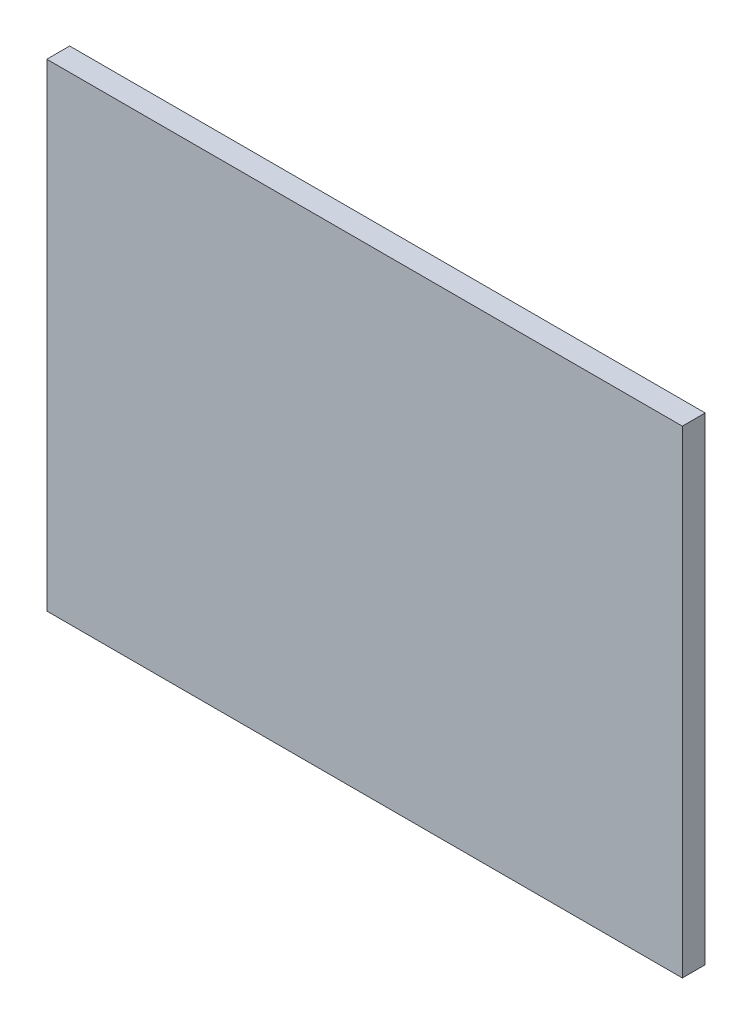
ISO-10303-21;
HEADER;
FILE_DESCRIPTION(('STEP AP214'),'2;1');
FILE_NAME('part.step','',(''),(''),'','','');
FILE_SCHEMA(('AUTOMOTIVE_DESIGN { 1 0 10303 214 1 1 1 1 }'));
ENDSEC;
DATA;
#1=APPLICATION_CONTEXT('core data for automotive mechanical design processes');
#2=APPLICATION_PROTOCOL_DEFINITION('international standard','automotive_design',2000,#1);
#3=PRODUCT_CONTEXT('',#1,'mechanical');
#4=PRODUCT('Part','Part','',(#3));
#5=PRODUCT_RELATED_PRODUCT_CATEGORY('part','',(#4));
#6=PRODUCT_DEFINITION_FORMATION('','',#4);
#7=PRODUCT_DEFINITION_CONTEXT('part definition',#1,'design');
#8=PRODUCT_DEFINITION('design','',#6,#7);
#9=PRODUCT_DEFINITION_SHAPE('','',#8);
#10=(LENGTH_UNIT() NAMED_UNIT(*) SI_UNIT(.MILLI.,.METRE.));
#11=(NAMED_UNIT(*) PLANE_ANGLE_UNIT() SI_UNIT($,.RADIAN.));
#12=(NAMED_UNIT(*) SI_UNIT($,.STERADIAN.) SOLID_ANGLE_UNIT());
#13=UNCERTAINTY_MEASURE_WITH_UNIT(LENGTH_MEASURE(1.E-05),#10,'distance_accuracy_value','');
#14=(GEOMETRIC_REPRESENTATION_CONTEXT(3) GLOBAL_UNCERTAINTY_ASSIGNED_CONTEXT((#13)) GLOBAL_UNIT_ASSIGNED_CONTEXT((#10,
#11,#12)) REPRESENTATION_CONTEXT('',''));
#15=CARTESIAN_POINT('',(0.,0.,0.));
#16=DIRECTION('',(0.,0.,1.));
#17=DIRECTION('',(1.,0.,0.));
#18=AXIS2_PLACEMENT_3D('',#15,#16,#17);
#19=CARTESIAN_POINT('',(0.,0.,18.));
#20=DIRECTION('',(1.,0.,0.));
#21=DIRECTION('',(0.,0.,-1.));
#22=AXIS2_PLACEMENT_3D('',#19,#20,#21);
#23=PLANE('',#22);
#24=DIRECTION('',(0.,-1.,0.));
#25=VECTOR('',#24,1.);
#26=CARTESIAN_POINT('',(0.,0.,0.));
#27=LINE('',#26,#25);
#28=CARTESIAN_POINT('',(0.,376.,0.));
#29=VERTEX_POINT('',#28);
#30=CARTESIAN_POINT('',(0.,0.,0.));
#31=VERTEX_POINT('',#30);
#32=EDGE_CURVE('E96',#29,#31,#27,.T.);
#33=ORIENTED_EDGE('',*,*,#32,.T.);
#34=DIRECTION('',(0.,0.,-1.));
#35=VECTOR('',#34,1.);
#36=CARTESIAN_POINT('',(0.,0.,18.));
#37=LINE('',#36,#35);
#38=CARTESIAN_POINT('',(0.,0.,18.));
#39=VERTEX_POINT('',#38);
#40=EDGE_CURVE('E11',#39,#31,#37,.T.);
#41=ORIENTED_EDGE('',*,*,#40,.F.);
#42=DIRECTION('',(0.,-1.,0.));
#43=VECTOR('',#42,1.);
#44=CARTESIAN_POINT('',(0.,0.,18.));
#45=LINE('',#44,#43);
#46=CARTESIAN_POINT('',(0.,376.,18.));
#47=VERTEX_POINT('',#46);
#48=EDGE_CURVE('E84',#47,#39,#45,.T.);
#49=ORIENTED_EDGE('',*,*,#48,.F.);
#50=DIRECTION('',(0.,0.,-1.));
#51=VECTOR('',#50,1.);
#52=CARTESIAN_POINT('',(0.,376.,18.));
#53=LINE('',#52,#51);
#54=EDGE_CURVE('E92',#47,#29,#53,.T.);
#55=ORIENTED_EDGE('',*,*,#54,.T.);
#56=EDGE_LOOP('',(#33,#41,#49,#55));
#57=FACE_BOUND('',#56,.T.);
#58=ADVANCED_FACE('F33',(#57),#23,.F.);
#59=CARTESIAN_POINT('',(0.,0.,18.));
#60=DIRECTION('',(0.,1.,0.));
#61=DIRECTION('',(0.,0.,1.));
#62=AXIS2_PLACEMENT_3D('',#59,#60,#61);
#63=PLANE('',#62);
#64=DIRECTION('',(1.,0.,0.));
#65=VECTOR('',#64,1.);
#66=CARTESIAN_POINT('',(0.,0.,0.));
#67=LINE('',#66,#65);
#68=CARTESIAN_POINT('',(500.,0.,0.));
#69=VERTEX_POINT('',#68);
#70=EDGE_CURVE('E88',#31,#69,#67,.T.);
#71=ORIENTED_EDGE('',*,*,#70,.T.);
#72=DIRECTION('',(0.,0.,-1.));
#73=VECTOR('',#72,1.);
#74=CARTESIAN_POINT('',(500.,0.,18.));
#75=LINE('',#74,#73);
#76=CARTESIAN_POINT('',(500.,0.,18.));
#77=VERTEX_POINT('',#76);
#78=EDGE_CURVE('E41',#77,#69,#75,.T.);
#79=ORIENTED_EDGE('',*,*,#78,.F.);
#80=DIRECTION('',(1.,0.,0.));
#81=VECTOR('',#80,1.);
#82=CARTESIAN_POINT('',(0.,0.,18.));
#83=LINE('',#82,#81);
#84=EDGE_CURVE('E79',#39,#77,#83,.T.);
#85=ORIENTED_EDGE('',*,*,#84,.F.);
#86=ORIENTED_EDGE('',*,*,#40,.T.);
#87=EDGE_LOOP('',(#71,#79,#85,#86));
#88=FACE_BOUND('',#87,.T.);
#89=ADVANCED_FACE('F87',(#88),#63,.F.);
#90=CARTESIAN_POINT('',(500.,0.,18.));
#91=DIRECTION('',(-1.,0.,0.));
#92=DIRECTION('',(0.,0.,1.));
#93=AXIS2_PLACEMENT_3D('',#90,#91,#92);
#94=PLANE('',#93);
#95=DIRECTION('',(0.,1.,0.));
#96=VECTOR('',#95,1.);
#97=CARTESIAN_POINT('',(500.,0.,0.));
#98=LINE('',#97,#96);
#99=CARTESIAN_POINT('',(500.,376.,0.));
#100=VERTEX_POINT('',#99);
#101=EDGE_CURVE('E66',#69,#100,#98,.T.);
#102=ORIENTED_EDGE('',*,*,#101,.T.);
#103=DIRECTION('',(0.,0.,-1.));
#104=VECTOR('',#103,1.);
#105=CARTESIAN_POINT('',(500.,376.,18.));
#106=LINE('',#105,#104);
#107=CARTESIAN_POINT('',(500.,376.,18.));
#108=VERTEX_POINT('',#107);
#109=EDGE_CURVE('E89',#108,#100,#106,.T.);
#110=ORIENTED_EDGE('',*,*,#109,.F.);
#111=DIRECTION('',(0.,1.,0.));
#112=VECTOR('',#111,1.);
#113=CARTESIAN_POINT('',(500.,0.,18.));
#114=LINE('',#113,#112);
#115=EDGE_CURVE('E82',#77,#108,#114,.T.);
#116=ORIENTED_EDGE('',*,*,#115,.F.);
#117=ORIENTED_EDGE('',*,*,#78,.T.);
#118=EDGE_LOOP('',(#102,#110,#116,#117));
#119=FACE_BOUND('',#118,.T.);
#120=ADVANCED_FACE('F90',(#119),#94,.F.);
#121=CARTESIAN_POINT('',(0.,376.,18.));
#122=DIRECTION('',(0.,-1.,0.));
#123=DIRECTION('',(0.,0.,-1.));
#124=AXIS2_PLACEMENT_3D('',#121,#122,#123);
#125=PLANE('',#124);
#126=DIRECTION('',(-1.,0.,0.));
#127=VECTOR('',#126,1.);
#128=CARTESIAN_POINT('',(0.,376.,0.));
#129=LINE('',#128,#127);
#130=EDGE_CURVE('E72',#100,#29,#129,.T.);
#131=ORIENTED_EDGE('',*,*,#130,.T.);
#132=ORIENTED_EDGE('',*,*,#54,.F.);
#133=DIRECTION('',(-1.,0.,0.));
#134=VECTOR('',#133,1.);
#135=CARTESIAN_POINT('',(0.,376.,18.));
#136=LINE('',#135,#134);
#137=EDGE_CURVE('E49',#108,#47,#136,.T.);
#138=ORIENTED_EDGE('',*,*,#137,.F.);
#139=ORIENTED_EDGE('',*,*,#109,.T.);
#140=EDGE_LOOP('',(#131,#132,#138,#139));
#141=FACE_BOUND('',#140,.T.);
#142=ADVANCED_FACE('F103',(#141),#125,.F.);
#143=CARTESIAN_POINT('',(0.,0.,18.));
#144=DIRECTION('',(0.,0.,-1.));
#145=DIRECTION('',(-1.,0.,0.));
#146=AXIS2_PLACEMENT_3D('',#143,#144,#145);
#147=PLANE('',#146);
#148=ORIENTED_EDGE('',*,*,#48,.T.);
#149=ORIENTED_EDGE('',*,*,#84,.T.);
#150=ORIENTED_EDGE('',*,*,#115,.T.);
#151=ORIENTED_EDGE('',*,*,#137,.T.);
#152=EDGE_LOOP('',(#148,#149,#150,#151));
#153=FACE_BOUND('',#152,.T.);
#154=ADVANCED_FACE('F80',(#153),#147,.F.);
#155=CARTESIAN_POINT('',(0.,0.,0.));
#156=DIRECTION('',(0.,0.,-1.));
#157=DIRECTION('',(-1.,0.,0.));
#158=AXIS2_PLACEMENT_3D('',#155,#156,#157);
#159=PLANE('',#158);
#160=ORIENTED_EDGE('',*,*,#32,.F.);
#161=ORIENTED_EDGE('',*,*,#130,.F.);
#162=ORIENTED_EDGE('',*,*,#101,.F.);
#163=ORIENTED_EDGE('',*,*,#70,.F.);
#164=EDGE_LOOP('',(#160,#161,#162,#163));
#165=FACE_BOUND('',#164,.T.);
#166=ADVANCED_FACE('F106',(#165),#159,.T.);
#167=CLOSED_SHELL('',(#58,#89,#120,#142,#154,#166));
#168=MANIFOLD_SOLID_BREP('B2',#167);
#169=ADVANCED_BREP_SHAPE_REPRESENTATION('',(#18,#168),#14);
#170=SHAPE_DEFINITION_REPRESENTATION(#9,#169);
ENDSEC;
END-ISO-10303-21;
